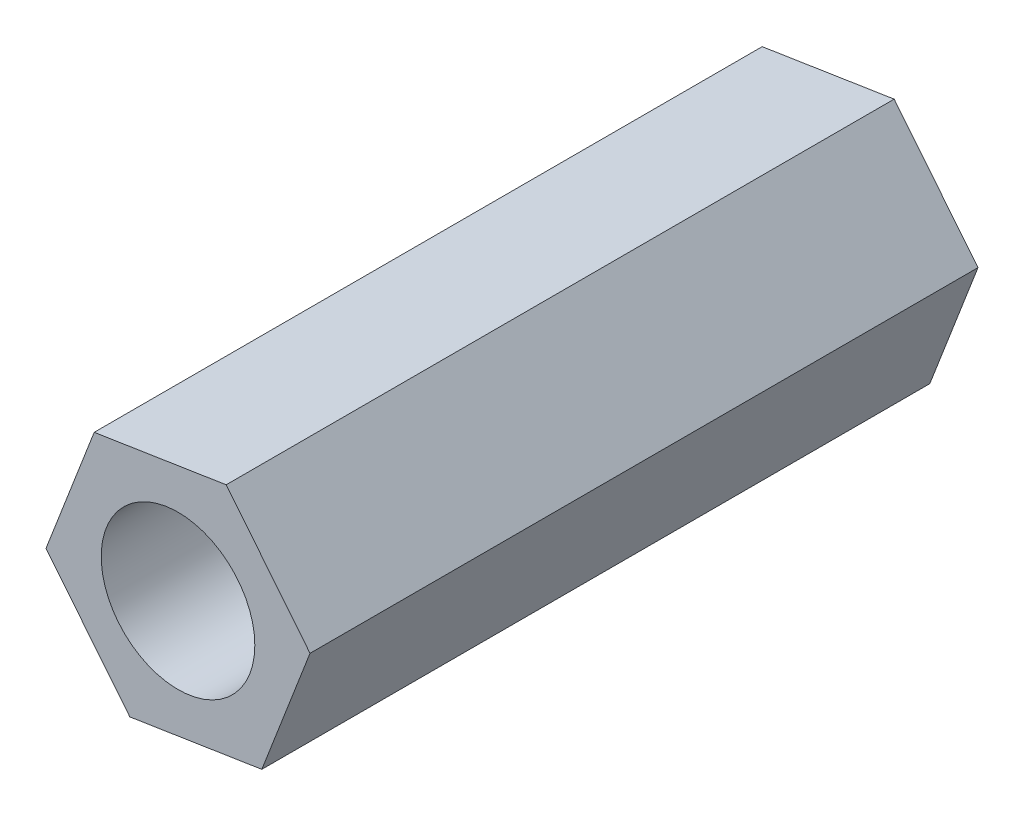
ISO-10303-21;
HEADER;
FILE_DESCRIPTION(('STEP AP214'),'2;1');
FILE_NAME('part.step','',(''),(''),'','','');
FILE_SCHEMA(('AUTOMOTIVE_DESIGN { 1 0 10303 214 1 1 1 1 }'));
ENDSEC;
DATA;
#1=APPLICATION_CONTEXT('core data for automotive mechanical design processes');
#2=APPLICATION_PROTOCOL_DEFINITION('international standard','automotive_design',2000,#1);
#3=PRODUCT_CONTEXT('',#1,'mechanical');
#4=PRODUCT('Part','Part','',(#3));
#5=PRODUCT_RELATED_PRODUCT_CATEGORY('part','',(#4));
#6=PRODUCT_DEFINITION_FORMATION('','',#4);
#7=PRODUCT_DEFINITION_CONTEXT('part definition',#1,'design');
#8=PRODUCT_DEFINITION('design','',#6,#7);
#9=PRODUCT_DEFINITION_SHAPE('','',#8);
#10=(LENGTH_UNIT() NAMED_UNIT(*) SI_UNIT(.MILLI.,.METRE.));
#11=(NAMED_UNIT(*) PLANE_ANGLE_UNIT() SI_UNIT($,.RADIAN.));
#12=(NAMED_UNIT(*) SI_UNIT($,.STERADIAN.) SOLID_ANGLE_UNIT());
#13=UNCERTAINTY_MEASURE_WITH_UNIT(LENGTH_MEASURE(1.E-05),#10,'distance_accuracy_value','');
#14=(GEOMETRIC_REPRESENTATION_CONTEXT(3) GLOBAL_UNCERTAINTY_ASSIGNED_CONTEXT((#13)) GLOBAL_UNIT_ASSIGNED_CONTEXT((#10,
#11,#12)) REPRESENTATION_CONTEXT('',''));
#15=CARTESIAN_POINT('',(0.,0.,0.));
#16=DIRECTION('',(0.,0.,1.));
#17=DIRECTION('',(1.,0.,0.));
#18=AXIS2_PLACEMENT_3D('',#15,#16,#17);
#19=CARTESIAN_POINT('',(6.27357568542462,-7.78731327989629,50.));
#20=DIRECTION('',(0.,0.,1.));
#21=DIRECTION('',(1.,0.,0.));
#22=AXIS2_PLACEMENT_3D('',#19,#20,#21);
#23=PLANE('',#22);
#24=DIRECTION('',(0.988079897033041,0.153941927619395,0.));
#25=VECTOR('',#24,1.);
#26=CARTESIAN_POINT('',(-3.60722328490579,-9.32673255609024,50.));
#27=LINE('',#26,#25);
#28=CARTESIAN_POINT('',(-3.60722328490579,-9.32673255609024,50.));
#29=VERTEX_POINT('',#28);
#30=CARTESIAN_POINT('',(6.27357568542462,-7.78731327989629,50.));
#31=VERTEX_POINT('',#30);
#32=EDGE_CURVE('E137',#29,#31,#27,.T.);
#33=ORIENTED_EDGE('',*,*,#32,.T.);
#34=DIRECTION('',(0.360722328490579,0.932673255609023,0.));
#35=VECTOR('',#34,1.);
#36=CARTESIAN_POINT('',(6.27357568542462,-7.78731327989629,50.));
#37=LINE('',#36,#35);
#38=CARTESIAN_POINT('',(9.88079897033041,1.53941927619395,50.));
#39=VERTEX_POINT('',#38);
#40=EDGE_CURVE('E95',#31,#39,#37,.T.);
#41=ORIENTED_EDGE('',*,*,#40,.T.);
#42=DIRECTION('',(-0.627357568542462,0.778731327989629,0.));
#43=VECTOR('',#42,1.);
#44=CARTESIAN_POINT('',(9.88079897033041,1.53941927619395,50.));
#45=LINE('',#44,#43);
#46=CARTESIAN_POINT('',(3.6072232849058,9.32673255609023,50.));
#47=VERTEX_POINT('',#46);
#48=EDGE_CURVE('E108',#39,#47,#45,.T.);
#49=ORIENTED_EDGE('',*,*,#48,.T.);
#50=DIRECTION('',(-0.988079897033041,-0.153941927619395,0.));
#51=VECTOR('',#50,1.);
#52=CARTESIAN_POINT('',(3.6072232849058,9.32673255609023,50.));
#53=LINE('',#52,#51);
#54=CARTESIAN_POINT('',(-6.27357568542461,7.78731327989628,50.));
#55=VERTEX_POINT('',#54);
#56=EDGE_CURVE('E102',#47,#55,#53,.T.);
#57=ORIENTED_EDGE('',*,*,#56,.T.);
#58=DIRECTION('',(-0.360722328490579,-0.932673255609023,0.));
#59=VECTOR('',#58,1.);
#60=CARTESIAN_POINT('',(-6.27357568542461,7.78731327989628,50.));
#61=LINE('',#60,#59);
#62=CARTESIAN_POINT('',(-9.8807989703304,-1.53941927619395,50.));
#63=VERTEX_POINT('',#62);
#64=EDGE_CURVE('E106',#55,#63,#61,.T.);
#65=ORIENTED_EDGE('',*,*,#64,.T.);
#66=DIRECTION('',(0.627357568542461,-0.778731327989629,0.));
#67=VECTOR('',#66,1.);
#68=CARTESIAN_POINT('',(-9.8807989703304,-1.53941927619395,50.));
#69=LINE('',#68,#67);
#70=EDGE_CURVE('E58',#63,#29,#69,.T.);
#71=ORIENTED_EDGE('',*,*,#70,.T.);
#72=EDGE_LOOP('',(#33,#41,#49,#57,#65,#71));
#73=FACE_BOUND('',#72,.T.);
#74=CARTESIAN_POINT('',(0.,0.,50.));
#75=DIRECTION('',(0.,0.,1.));
#76=DIRECTION('',(1.,0.,0.));
#77=AXIS2_PLACEMENT_3D('',#74,#75,#76);
#78=CIRCLE('',#77,5.75);
#79=CARTESIAN_POINT('',(5.75,0.,50.));
#80=VERTEX_POINT('',#79);
#81=EDGE_CURVE('E130',#80,#80,#78,.T.);
#82=ORIENTED_EDGE('',*,*,#81,.F.);
#83=EDGE_LOOP('',(#82));
#84=FACE_BOUND('',#83,.T.);
#85=ADVANCED_FACE('F36',(#73,#84),#23,.T.);
#86=CARTESIAN_POINT('',(6.27357568542462,-7.78731327989629,0.));
#87=DIRECTION('',(0.,0.,1.));
#88=DIRECTION('',(1.,0.,0.));
#89=AXIS2_PLACEMENT_3D('',#86,#87,#88);
#90=PLANE('',#89);
#91=DIRECTION('',(0.988079897033041,0.153941927619395,0.));
#92=VECTOR('',#91,1.);
#93=CARTESIAN_POINT('',(-3.60722328490579,-9.32673255609024,0.));
#94=LINE('',#93,#92);
#95=CARTESIAN_POINT('',(-3.60722328490579,-9.32673255609024,0.));
#96=VERTEX_POINT('',#95);
#97=CARTESIAN_POINT('',(6.27357568542462,-7.78731327989629,0.));
#98=VERTEX_POINT('',#97);
#99=EDGE_CURVE('E126',#96,#98,#94,.T.);
#100=ORIENTED_EDGE('',*,*,#99,.F.);
#101=DIRECTION('',(0.627357568542461,-0.778731327989629,0.));
#102=VECTOR('',#101,1.);
#103=CARTESIAN_POINT('',(-9.8807989703304,-1.53941927619395,0.));
#104=LINE('',#103,#102);
#105=CARTESIAN_POINT('',(-9.8807989703304,-1.53941927619395,0.));
#106=VERTEX_POINT('',#105);
#107=EDGE_CURVE('E87',#106,#96,#104,.T.);
#108=ORIENTED_EDGE('',*,*,#107,.F.);
#109=DIRECTION('',(-0.360722328490579,-0.932673255609023,0.));
#110=VECTOR('',#109,1.);
#111=CARTESIAN_POINT('',(-6.27357568542461,7.78731327989628,0.));
#112=LINE('',#111,#110);
#113=CARTESIAN_POINT('',(-6.27357568542461,7.78731327989628,0.));
#114=VERTEX_POINT('',#113);
#115=EDGE_CURVE('E81',#114,#106,#112,.T.);
#116=ORIENTED_EDGE('',*,*,#115,.F.);
#117=DIRECTION('',(-0.988079897033041,-0.153941927619395,0.));
#118=VECTOR('',#117,1.);
#119=CARTESIAN_POINT('',(3.6072232849058,9.32673255609023,0.));
#120=LINE('',#119,#118);
#121=CARTESIAN_POINT('',(3.6072232849058,9.32673255609023,0.));
#122=VERTEX_POINT('',#121);
#123=EDGE_CURVE('E116',#122,#114,#120,.T.);
#124=ORIENTED_EDGE('',*,*,#123,.F.);
#125=DIRECTION('',(-0.627357568542462,0.778731327989629,0.));
#126=VECTOR('',#125,1.);
#127=CARTESIAN_POINT('',(9.88079897033041,1.53941927619395,0.));
#128=LINE('',#127,#126);
#129=CARTESIAN_POINT('',(9.88079897033041,1.53941927619395,0.));
#130=VERTEX_POINT('',#129);
#131=EDGE_CURVE('E132',#130,#122,#128,.T.);
#132=ORIENTED_EDGE('',*,*,#131,.F.);
#133=DIRECTION('',(0.360722328490579,0.932673255609023,0.));
#134=VECTOR('',#133,1.);
#135=CARTESIAN_POINT('',(6.27357568542462,-7.78731327989629,0.));
#136=LINE('',#135,#134);
#137=EDGE_CURVE('E129',#98,#130,#136,.T.);
#138=ORIENTED_EDGE('',*,*,#137,.F.);
#139=EDGE_LOOP('',(#100,#108,#116,#124,#132,#138));
#140=FACE_BOUND('',#139,.T.);
#141=CARTESIAN_POINT('',(0.,0.,0.));
#142=DIRECTION('',(0.,0.,1.));
#143=DIRECTION('',(1.,0.,0.));
#144=AXIS2_PLACEMENT_3D('',#141,#142,#143);
#145=CIRCLE('',#144,5.75);
#146=CARTESIAN_POINT('',(5.75,0.,0.));
#147=VERTEX_POINT('',#146);
#148=EDGE_CURVE('E183',#147,#147,#145,.T.);
#149=ORIENTED_EDGE('',*,*,#148,.T.);
#150=EDGE_LOOP('',(#149));
#151=FACE_BOUND('',#150,.T.);
#152=ADVANCED_FACE('F147',(#140,#151),#90,.F.);
#153=CARTESIAN_POINT('',(-3.60722328490579,-9.32673255609024,50.));
#154=DIRECTION('',(-0.153941927619395,0.988079897033041,0.));
#155=DIRECTION('',(-0.988079897033041,-0.153941927619395,0.));
#156=AXIS2_PLACEMENT_3D('',#153,#154,#155);
#157=PLANE('',#156);
#158=ORIENTED_EDGE('',*,*,#99,.T.);
#159=DIRECTION('',(0.,0.,-1.));
#160=VECTOR('',#159,1.);
#161=CARTESIAN_POINT('',(6.27357568542462,-7.78731327989629,50.));
#162=LINE('',#161,#160);
#163=EDGE_CURVE('E11',#31,#98,#162,.T.);
#164=ORIENTED_EDGE('',*,*,#163,.F.);
#165=ORIENTED_EDGE('',*,*,#32,.F.);
#166=DIRECTION('',(0.,0.,-1.));
#167=VECTOR('',#166,1.);
#168=CARTESIAN_POINT('',(-3.60722328490579,-9.32673255609024,50.));
#169=LINE('',#168,#167);
#170=EDGE_CURVE('E122',#29,#96,#169,.T.);
#171=ORIENTED_EDGE('',*,*,#170,.T.);
#172=EDGE_LOOP('',(#158,#164,#165,#171));
#173=FACE_BOUND('',#172,.T.);
#174=ADVANCED_FACE('F38',(#173),#157,.F.);
#175=CARTESIAN_POINT('',(6.27357568542462,-7.78731327989629,50.));
#176=DIRECTION('',(-0.932673255609023,0.360722328490579,0.));
#177=DIRECTION('',(-0.360722328490579,-0.932673255609023,0.));
#178=AXIS2_PLACEMENT_3D('',#175,#176,#177);
#179=PLANE('',#178);
#180=ORIENTED_EDGE('',*,*,#137,.T.);
#181=DIRECTION('',(0.,0.,-1.));
#182=VECTOR('',#181,1.);
#183=CARTESIAN_POINT('',(9.88079897033041,1.53941927619395,50.));
#184=LINE('',#183,#182);
#185=EDGE_CURVE('E50',#39,#130,#184,.T.);
#186=ORIENTED_EDGE('',*,*,#185,.F.);
#187=ORIENTED_EDGE('',*,*,#40,.F.);
#188=ORIENTED_EDGE('',*,*,#163,.T.);
#189=EDGE_LOOP('',(#180,#186,#187,#188));
#190=FACE_BOUND('',#189,.T.);
#191=ADVANCED_FACE('F231',(#190),#179,.F.);
#192=CARTESIAN_POINT('',(9.88079897033041,1.53941927619395,50.));
#193=DIRECTION('',(-0.778731327989629,-0.627357568542462,0.));
#194=DIRECTION('',(0.627357568542462,-0.778731327989629,0.));
#195=AXIS2_PLACEMENT_3D('',#192,#193,#194);
#196=PLANE('',#195);
#197=ORIENTED_EDGE('',*,*,#131,.T.);
#198=DIRECTION('',(0.,0.,-1.));
#199=VECTOR('',#198,1.);
#200=CARTESIAN_POINT('',(3.6072232849058,9.32673255609023,50.));
#201=LINE('',#200,#199);
#202=EDGE_CURVE('E117',#47,#122,#201,.T.);
#203=ORIENTED_EDGE('',*,*,#202,.F.);
#204=ORIENTED_EDGE('',*,*,#48,.F.);
#205=ORIENTED_EDGE('',*,*,#185,.T.);
#206=EDGE_LOOP('',(#197,#203,#204,#205));
#207=FACE_BOUND('',#206,.T.);
#208=ADVANCED_FACE('F144',(#207),#196,.F.);
#209=CARTESIAN_POINT('',(3.6072232849058,9.32673255609023,50.));
#210=DIRECTION('',(0.153941927619395,-0.988079897033041,0.));
#211=DIRECTION('',(0.988079897033041,0.153941927619395,0.));
#212=AXIS2_PLACEMENT_3D('',#209,#210,#211);
#213=PLANE('',#212);
#214=ORIENTED_EDGE('',*,*,#123,.T.);
#215=DIRECTION('',(0.,0.,-1.));
#216=VECTOR('',#215,1.);
#217=CARTESIAN_POINT('',(-6.27357568542461,7.78731327989628,50.));
#218=LINE('',#217,#216);
#219=EDGE_CURVE('E113',#55,#114,#218,.T.);
#220=ORIENTED_EDGE('',*,*,#219,.F.);
#221=ORIENTED_EDGE('',*,*,#56,.F.);
#222=ORIENTED_EDGE('',*,*,#202,.T.);
#223=EDGE_LOOP('',(#214,#220,#221,#222));
#224=FACE_BOUND('',#223,.T.);
#225=ADVANCED_FACE('F114',(#224),#213,.F.);
#226=CARTESIAN_POINT('',(-6.27357568542461,7.78731327989628,50.));
#227=DIRECTION('',(0.932673255609023,-0.360722328490579,0.));
#228=DIRECTION('',(0.360722328490579,0.932673255609023,0.));
#229=AXIS2_PLACEMENT_3D('',#226,#227,#228);
#230=PLANE('',#229);
#231=ORIENTED_EDGE('',*,*,#115,.T.);
#232=DIRECTION('',(0.,0.,-1.));
#233=VECTOR('',#232,1.);
#234=CARTESIAN_POINT('',(-9.8807989703304,-1.53941927619395,50.));
#235=LINE('',#234,#233);
#236=EDGE_CURVE('E118',#63,#106,#235,.T.);
#237=ORIENTED_EDGE('',*,*,#236,.F.);
#238=ORIENTED_EDGE('',*,*,#64,.F.);
#239=ORIENTED_EDGE('',*,*,#219,.T.);
#240=EDGE_LOOP('',(#231,#237,#238,#239));
#241=FACE_BOUND('',#240,.T.);
#242=ADVANCED_FACE('F120',(#241),#230,.F.);
#243=CARTESIAN_POINT('',(-9.8807989703304,-1.53941927619395,50.));
#244=DIRECTION('',(0.778731327989629,0.627357568542462,0.));
#245=DIRECTION('',(-0.627357568542462,0.778731327989629,0.));
#246=AXIS2_PLACEMENT_3D('',#243,#244,#245);
#247=PLANE('',#246);
#248=CARTESIAN_POINT('',(-6.7440111276181,-5.43307591614209,9.32204209771188));
#249=DIRECTION('',(-0.778731327989629,-0.627357568542462,0.));
#250=DIRECTION('',(0.627357568542462,-0.778731327989629,0.));
#251=AXIS2_PLACEMENT_3D('',#248,#249,#250);
#252=CIRCLE('',#251,2.1);
#253=CARTESIAN_POINT('',(-5.42656023367892,-7.06841170492031,9.32204209771188));
#254=VERTEX_POINT('',#253);
#255=EDGE_CURVE('E181',#254,#254,#252,.T.);
#256=ORIENTED_EDGE('',*,*,#255,.F.);
#257=EDGE_LOOP('',(#256));
#258=FACE_BOUND('',#257,.T.);
#259=ORIENTED_EDGE('',*,*,#107,.T.);
#260=ORIENTED_EDGE('',*,*,#170,.F.);
#261=ORIENTED_EDGE('',*,*,#70,.F.);
#262=ORIENTED_EDGE('',*,*,#236,.T.);
#263=EDGE_LOOP('',(#259,#260,#261,#262));
#264=FACE_BOUND('',#263,.T.);
#265=ADVANCED_FACE('F152',(#258,#264),#247,.F.);
#266=CARTESIAN_POINT('',(0.,0.,50.));
#267=DIRECTION('',(0.,0.,-1.));
#268=DIRECTION('',(-1.,0.,0.));
#269=AXIS2_PLACEMENT_3D('',#266,#267,#268);
#270=CYLINDRICAL_SURFACE('',#269,5.75);
#271=CARTESIAN_POINT('',(-2.85094449785943,-4.99345726627604,9.32204209771188));
#272=CARTESIAN_POINT('',(-2.85094019598946,-4.99345795167312,9.20839193109475));
#273=CARTESIAN_POINT('',(-2.85960110991992,-4.98854414042882,9.09476370150913));
#274=CARTESIAN_POINT('',(-2.89360931317424,-4.9688937743896,8.87091880421881));
#275=CARTESIAN_POINT('',(-2.91895681177641,-4.95415709639911,8.76070217931962));
#276=CARTESIAN_POINT('',(-2.9845848404332,-4.91489534245442,8.54697068036961));
#277=CARTESIAN_POINT('',(-3.02483122215517,-4.89039264051897,8.44344111194284));
#278=CARTESIAN_POINT('',(-3.11796534201463,-4.83154391393881,8.24524945878198));
#279=CARTESIAN_POINT('',(-3.17085665818131,-4.79719510267613,8.15058989448905));
#280=CARTESIAN_POINT('',(-3.28919395862666,-4.71688677731589,7.96836723748016));
#281=CARTESIAN_POINT('',(-3.35508047111332,-4.67049316366211,7.88128142043983));
#282=CARTESIAN_POINT('',(-3.49480071874743,-4.56688350300289,7.72100263666585));
#283=CARTESIAN_POINT('',(-3.56863603474427,-4.50966530149537,7.64781244150659));
#284=CARTESIAN_POINT('',(-3.72364292396436,-4.38261655010561,7.51513648488338));
#285=CARTESIAN_POINT('',(-3.80497375323429,-4.3124406424868,7.45616493970613));
#286=CARTESIAN_POINT('',(-3.96937251523581,-4.16161034375023,7.35703151394349));
#287=CARTESIAN_POINT('',(-4.05243986948726,-4.08095939689158,7.31686347054855));
#288=CARTESIAN_POINT('',(-4.21349228252758,-3.9143135479967,7.2581375375674));
#289=CARTESIAN_POINT('',(-4.29154587129513,-3.82867475299159,7.23875896504517));
#290=CARTESIAN_POINT('',(-4.44324886175916,-3.65152317094754,7.21953739653935));
#291=CARTESIAN_POINT('',(-4.51689961516625,-3.56001220479436,7.21968837366929));
#292=CARTESIAN_POINT('',(-4.65417023740214,-3.37839582495307,7.2390332251236));
#293=CARTESIAN_POINT('',(-4.71809875059279,-3.28842623739212,7.25733244027025));
#294=CARTESIAN_POINT('',(-4.83848622383268,-3.1085795957101,7.31095562087636));
#295=CARTESIAN_POINT('',(-4.89494465822162,-3.01870254854207,7.34628078361975));
#296=CARTESIAN_POINT('',(-5.00042465546329,-2.84062067091632,7.43339390463368));
#297=CARTESIAN_POINT('',(-5.0493285321913,-2.75245803543898,7.48540970494214));
#298=CARTESIAN_POINT('',(-5.13860149282857,-2.58196618979623,7.60422964332381));
#299=CARTESIAN_POINT('',(-5.17896789708268,-2.49963881651843,7.67103841103536));
#300=CARTESIAN_POINT('',(-5.25348458238367,-2.33915843812144,7.82190792242823));
#301=CARTESIAN_POINT('',(-5.28716269009308,-2.26149423596301,7.90672296716359));
#302=CARTESIAN_POINT('',(-5.34597919661941,-2.11872192585142,8.08898505699764));
#303=CARTESIAN_POINT('',(-5.37111567297868,-2.05361664594773,8.18643493899894));
#304=CARTESIAN_POINT('',(-5.41400455587518,-1.93777205217538,8.39374061256328));
#305=CARTESIAN_POINT('',(-5.43159837825991,-1.88734781553788,8.503806401243));
#306=CARTESIAN_POINT('',(-5.45934148160388,-1.80554115442812,8.7316730596698));
#307=CARTESIAN_POINT('',(-5.46949465003153,-1.77414878798573,8.84946985514699));
#308=CARTESIAN_POINT('',(-5.48248975035877,-1.73356252801873,9.08279500554436));
#309=CARTESIAN_POINT('',(-5.48568950554917,-1.72328378324306,9.19811457993717));
#310=CARTESIAN_POINT('',(-5.4859918085325,-1.72232344051595,9.42882874690611));
#311=CARTESIAN_POINT('',(-5.48309576992866,-1.73163729907597,9.54422331588742));
#312=CARTESIAN_POINT('',(-5.47134372460363,-1.76839951054568,9.76648515087396));
#313=CARTESIAN_POINT('',(-5.4627561844861,-1.79503001928648,9.87350405049118));
#314=CARTESIAN_POINT('',(-5.43955975664828,-1.86413752685014,10.0815975667839));
#315=CARTESIAN_POINT('',(-5.42494967411989,-1.90661766991245,10.182670999393));
#316=CARTESIAN_POINT('',(-5.38856872206337,-2.00718133837428,10.3800685665223));
#317=CARTESIAN_POINT('',(-5.36655785180419,-2.06577388638219,10.4760884723187));
#318=CARTESIAN_POINT('',(-5.31490349632455,-2.19525691184229,10.6571732707844));
#319=CARTESIAN_POINT('',(-5.28525734324871,-2.26615168500268,10.7422343186863));
#320=CARTESIAN_POINT('',(-5.21570285704357,-2.42211640142111,10.9042382194678));
#321=CARTESIAN_POINT('',(-5.17528844166893,-2.50777915455819,10.9803957171329));
#322=CARTESIAN_POINT('',(-5.08470805921784,-2.68668634270561,11.116264444544));
#323=CARTESIAN_POINT('',(-5.0345421736989,-2.77993071430245,11.1759758118289));
#324=CARTESIAN_POINT('',(-4.92470406677039,-2.9701488230329,11.2768149376321));
#325=CARTESIAN_POINT('',(-4.86507499764538,-3.06710418411439,11.318023948979));
#326=CARTESIAN_POINT('',(-4.73692931923996,-3.26152229603201,11.3806479858493));
#327=CARTESIAN_POINT('',(-4.66841666067714,-3.3589848029453,11.4020717760768));
#328=CARTESIAN_POINT('',(-4.52819749628104,-3.54553047708878,11.423608983516));
#329=CARTESIAN_POINT('',(-4.4568801857246,-3.63477828479757,11.4248407138098));
#330=CARTESIAN_POINT('',(-4.30992599786387,-3.80787643919158,11.4088066485788));
#331=CARTESIAN_POINT('',(-4.23428959792754,-3.89172738019556,11.3915428935383));
#332=CARTESIAN_POINT('',(-4.08298054271981,-4.05012521990916,11.3397849689489));
#333=CARTESIAN_POINT('',(-4.007345886193,-4.12483720705498,11.3056813838299));
#334=CARTESIAN_POINT('',(-3.85700128884772,-4.26575535342066,11.2215934232045));
#335=CARTESIAN_POINT('',(-3.78229152514797,-4.331959905542,11.1716060533443));
#336=CARTESIAN_POINT('',(-3.6334261684723,-4.45764457421515,11.0548313635583));
#337=CARTESIAN_POINT('',(-3.55941879920746,-4.51673785261411,10.9874394349463));
#338=CARTESIAN_POINT('',(-3.41813008911382,-4.62458653289477,10.8387393884763));
#339=CARTESIAN_POINT('',(-3.3508511083335,-4.6733383140699,10.757426414607));
#340=CARTESIAN_POINT('',(-3.22278975998561,-4.7626174251976,10.5784093094645));
#341=CARTESIAN_POINT('',(-3.16249257573955,-4.80261943018133,10.4800938461755));
#342=CARTESIAN_POINT('',(-3.05569185953704,-4.87127235799716,10.2725737744538));
#343=CARTESIAN_POINT('',(-3.00918842315019,-4.89992320218352,10.1633690905824));
#344=CARTESIAN_POINT('',(-2.93209597536429,-4.94645387596561,9.9344931045429));
#345=CARTESIAN_POINT('',(-2.9018758709775,-4.96408536699909,9.81464556915743));
#346=CARTESIAN_POINT('',(-2.86130813124414,-4.98758334387062,9.5705356171685));
#347=CARTESIAN_POINT('',(-2.85094920033403,-4.99345651705248,9.44627575095556));
#348=CARTESIAN_POINT('',(-2.85094449785943,-4.99345726627604,9.32204209771188));
#349=B_SPLINE_CURVE_WITH_KNOTS('',3,(#271,#272,#273,#274,#275,#276,#277,#278,#279,#280,#281,
#282,#283,#284,#285,#286,#287,#288,#289,#290,#291,#292,#293,#294,#295,#296,#297,#298,#299,#300,
#301,#302,#303,#304,#305,#306,#307,#308,#309,#310,#311,#312,#313,#314,#315,#316,#317,#318,#319,
#320,#321,#322,#323,#324,#325,#326,#327,#328,#329,#330,#331,#332,#333,#334,#335,#336,#337,#338,
#339,#340,#341,#342,#343,#344,#345,#346,#347,#348),.UNSPECIFIED.,.T.,.F.,(4,2,2,2,2,2,2,2,2,2,2,
2,2,2,2,2,2,2,2,2,2,2,2,2,2,2,2,2,2,2,2,2,2,2,2,2,2,2,4),(0.,0.340488501554304,0.68098127349793,
1.0206984175771,1.36051180252804,1.71487245347827,2.06930370993877,2.43509078946357,
2.8007578989338,3.15138894216515,3.50191177970407,3.8359727444387,4.17005720414706,
4.50891145536137,4.84787190538679,5.20573456073134,5.56367770665255,5.92881589191279,
6.29376316961045,6.63943564993081,6.98502797827837,7.31537969802139,7.64579698758398,
7.98817137019211,8.33066554502068,8.69356037123339,9.05645216246519,9.4177343476987,
9.77885641076456,10.1199060969734,10.4609181613043,10.7943680771077,11.1278808910157,
11.4750635160196,11.8223674947468,12.1868300258743,12.5512950821114,12.9237028815615,
13.2958988201567),.UNSPECIFIED.);
#350=CARTESIAN_POINT('',(-2.85094449785943,-4.99345726627604,9.32204209771188));
#351=VERTEX_POINT('',#350);
#352=EDGE_CURVE('E40',#351,#351,#349,.T.);
#353=ORIENTED_EDGE('',*,*,#352,.F.);
#354=EDGE_LOOP('',(#353));
#355=FACE_BOUND('',#354,.T.);
#356=ORIENTED_EDGE('',*,*,#81,.T.);
#357=EDGE_LOOP('',(#356));
#358=FACE_BOUND('',#357,.T.);
#359=ORIENTED_EDGE('',*,*,#148,.F.);
#360=EDGE_LOOP('',(#359));
#361=FACE_BOUND('',#360,.T.);
#362=ADVANCED_FACE('F154',(#355,#358,#361),#270,.F.);
#363=CARTESIAN_POINT('',(-6.7440111276181,-5.43307591614209,9.32204209771188));
#364=DIRECTION('',(-0.778731327989629,-0.627357568542462,0.));
#365=DIRECTION('',(0.627357568542462,-0.778731327989629,0.));
#366=AXIS2_PLACEMENT_3D('',#363,#364,#365);
#367=CYLINDRICAL_SURFACE('',#366,2.1);
#368=ORIENTED_EDGE('',*,*,#352,.T.);
#369=EDGE_LOOP('',(#368));
#370=FACE_BOUND('',#369,.T.);
#371=ORIENTED_EDGE('',*,*,#255,.T.);
#372=EDGE_LOOP('',(#371));
#373=FACE_BOUND('',#372,.T.);
#374=ADVANCED_FACE('F161',(#370,#373),#367,.F.);
#375=CLOSED_SHELL('',(#85,#152,#174,#191,#208,#225,#242,#265,#362,#374));
#376=MANIFOLD_SOLID_BREP('B2',#375);
#377=ADVANCED_BREP_SHAPE_REPRESENTATION('',(#18,#376),#14);
#378=SHAPE_DEFINITION_REPRESENTATION(#9,#377);
ENDSEC;
END-ISO-10303-21;
